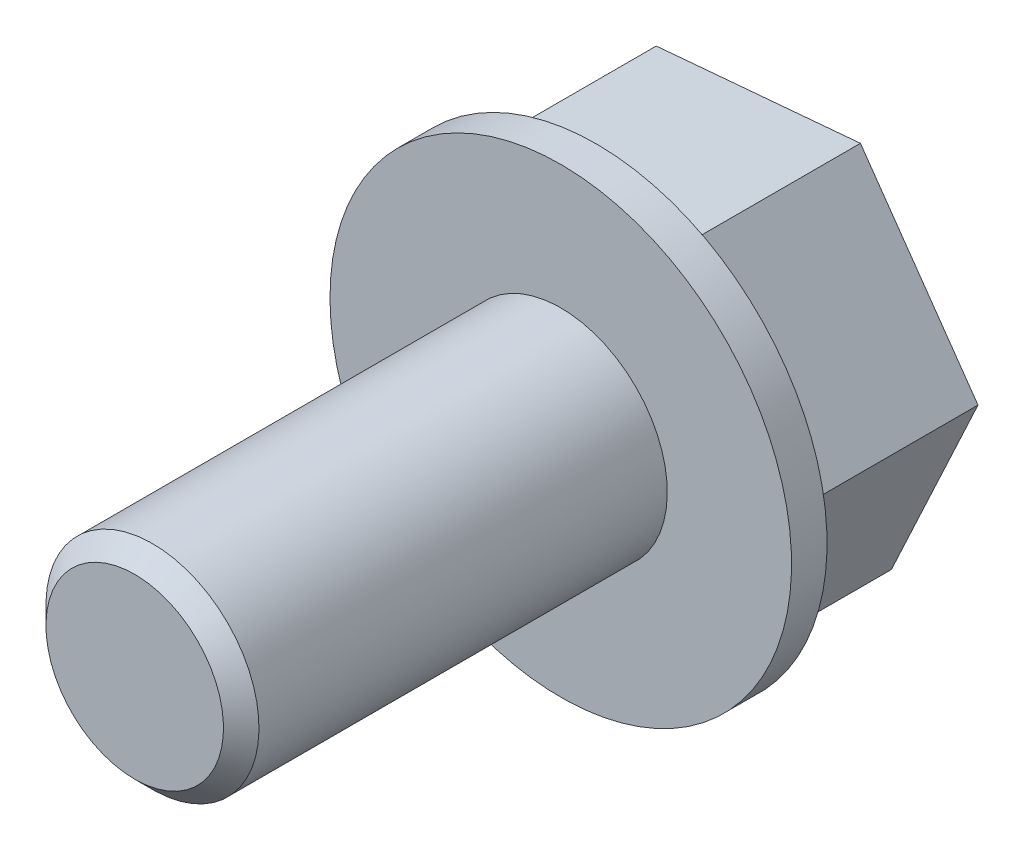
ISO-10303-21;
HEADER;
FILE_DESCRIPTION(('STEP AP214'),'2;1');
FILE_NAME('part.step','',(''),(''),'','','');
FILE_SCHEMA(('AUTOMOTIVE_DESIGN { 1 0 10303 214 1 1 1 1 }'));
ENDSEC;
DATA;
#1=APPLICATION_CONTEXT('core data for automotive mechanical design processes');
#2=APPLICATION_PROTOCOL_DEFINITION('international standard','automotive_design',2000,#1);
#3=PRODUCT_CONTEXT('',#1,'mechanical');
#4=PRODUCT('Part','Part','',(#3));
#5=PRODUCT_RELATED_PRODUCT_CATEGORY('part','',(#4));
#6=PRODUCT_DEFINITION_FORMATION('','',#4);
#7=PRODUCT_DEFINITION_CONTEXT('part definition',#1,'design');
#8=PRODUCT_DEFINITION('design','',#6,#7);
#9=PRODUCT_DEFINITION_SHAPE('','',#8);
#10=(LENGTH_UNIT() NAMED_UNIT(*) SI_UNIT(.MILLI.,.METRE.));
#11=(NAMED_UNIT(*) PLANE_ANGLE_UNIT() SI_UNIT($,.RADIAN.));
#12=(NAMED_UNIT(*) SI_UNIT($,.STERADIAN.) SOLID_ANGLE_UNIT());
#13=UNCERTAINTY_MEASURE_WITH_UNIT(LENGTH_MEASURE(1.E-05),#10,'distance_accuracy_value','');
#14=(GEOMETRIC_REPRESENTATION_CONTEXT(3) GLOBAL_UNCERTAINTY_ASSIGNED_CONTEXT((#13)) GLOBAL_UNIT_ASSIGNED_CONTEXT((#10,
#11,#12)) REPRESENTATION_CONTEXT('',''));
#15=CARTESIAN_POINT('',(0.,0.,0.));
#16=DIRECTION('',(0.,0.,1.));
#17=DIRECTION('',(1.,0.,0.));
#18=AXIS2_PLACEMENT_3D('',#15,#16,#17);
#19=CARTESIAN_POINT('',(-190.549789882902,-68.5538297659745,142.500001559556));
#20=DIRECTION('',(0.,0.,1.));
#21=DIRECTION('',(-0.996194698091746,-0.0871557427476581,0.));
#22=AXIS2_PLACEMENT_3D('',#19,#20,#21);
#23=PLANE('',#22);
#24=CARTESIAN_POINT('',(-190.549789882902,-68.5538297659745,142.500001559556));
#25=DIRECTION('',(0.,0.,1.));
#26=DIRECTION('',(-0.0871557427476581,0.996194698091746,0.));
#27=AXIS2_PLACEMENT_3D('',#24,#25,#26);
#28=CIRCLE('',#27,2.5);
#29=CARTESIAN_POINT('',(-190.767679239771,-66.0633430207451,142.500001559556));
#30=VERTEX_POINT('',#29);
#31=EDGE_CURVE('E25',#30,#30,#28,.T.);
#32=ORIENTED_EDGE('',*,*,#31,.T.);
#33=EDGE_LOOP('',(#32));
#34=FACE_BOUND('',#33,.T.);
#35=ADVANCED_FACE('F17',(#34),#23,.T.);
#36=CARTESIAN_POINT('',(-190.549789882902,-68.5538297659745,130.500001559556));
#37=DIRECTION('',(0.,0.,1.));
#38=DIRECTION('',(-0.996194698091746,-0.0871557427476581,0.));
#39=AXIS2_PLACEMENT_3D('',#36,#37,#38);
#40=CYLINDRICAL_SURFACE('',#39,3.);
#41=CARTESIAN_POINT('',(-190.549789882902,-68.5538297659745,142.000001559556));
#42=DIRECTION('',(0.,0.,1.));
#43=DIRECTION('',(0.996194698091746,0.0871557427476581,0.));
#44=AXIS2_PLACEMENT_3D('',#41,#42,#43);
#45=CIRCLE('',#44,3.);
#46=CARTESIAN_POINT('',(-187.561205788626,-68.2923625377315,142.000001559556));
#47=VERTEX_POINT('',#46);
#48=EDGE_CURVE('E11',#47,#47,#45,.F.);
#49=ORIENTED_EDGE('',*,*,#48,.T.);
#50=EDGE_LOOP('',(#49));
#51=FACE_BOUND('',#50,.T.);
#52=CARTESIAN_POINT('',(-190.549789882902,-68.5538297659745,130.500001559556));
#53=DIRECTION('',(0.,0.,-1.));
#54=DIRECTION('',(-0.996194698091746,-0.0871557427476581,0.));
#55=AXIS2_PLACEMENT_3D('',#52,#53,#54);
#56=CIRCLE('',#55,3.);
#57=CARTESIAN_POINT('',(-193.538373977177,-68.8152969942175,130.500001559556));
#58=VERTEX_POINT('',#57);
#59=EDGE_CURVE('E95',#58,#58,#56,.T.);
#60=ORIENTED_EDGE('',*,*,#59,.F.);
#61=EDGE_LOOP('',(#60));
#62=FACE_BOUND('',#61,.T.);
#63=ADVANCED_FACE('F152',(#51,#62),#40,.T.);
#64=CARTESIAN_POINT('',(-187.238244783621,-73.2832062987488,130.500001559556));
#65=DIRECTION('',(0.,0.,1.));
#66=DIRECTION('',(-0.996194698091746,-0.0871557427476581,0.));
#67=AXIS2_PLACEMENT_3D('',#64,#65,#66);
#68=PLANE('',#67);
#69=ORIENTED_EDGE('',*,*,#59,.T.);
#70=EDGE_LOOP('',(#69));
#71=FACE_BOUND('',#70,.T.);
#72=CARTESIAN_POINT('',(-190.549789882902,-68.553829765974,130.500001559556));
#73=DIRECTION('',(0.,0.,1.));
#74=DIRECTION('',(-0.996194698091746,-0.087155742747658,0.));
#75=AXIS2_PLACEMENT_3D('',#72,#73,#74);
#76=CIRCLE('',#75,6.5);
#77=CARTESIAN_POINT('',(-197.025055420498,-69.1203420938338,130.500001559556));
#78=VERTEX_POINT('',#77);
#79=EDGE_CURVE('E131',#78,#78,#76,.T.);
#80=ORIENTED_EDGE('',*,*,#79,.T.);
#81=EDGE_LOOP('',(#80));
#82=FACE_BOUND('',#81,.T.);
#83=ADVANCED_FACE('F149',(#71,#82),#68,.T.);
#84=CARTESIAN_POINT('',(-190.549789882902,-68.553829765974,129.500001559556));
#85=DIRECTION('',(0.,0.,1.));
#86=DIRECTION('',(-0.996194698091746,-0.0871557427476581,0.));
#87=AXIS2_PLACEMENT_3D('',#84,#85,#86);
#88=CYLINDRICAL_SURFACE('',#87,6.5);
#89=CARTESIAN_POINT('',(-190.549789882902,-68.553829765974,129.500001559556));
#90=DIRECTION('',(0.,0.,1.));
#91=DIRECTION('',(-0.996194698091746,-0.087155742747658,0.));
#92=AXIS2_PLACEMENT_3D('',#89,#90,#91);
#93=CIRCLE('',#92,6.5);
#94=CARTESIAN_POINT('',(-197.025055420498,-69.1203420938338,129.500001559556));
#95=VERTEX_POINT('',#94);
#96=EDGE_CURVE('E130',#95,#95,#93,.T.);
#97=ORIENTED_EDGE('',*,*,#96,.T.);
#98=EDGE_LOOP('',(#97));
#99=FACE_BOUND('',#98,.T.);
#100=ORIENTED_EDGE('',*,*,#79,.F.);
#101=EDGE_LOOP('',(#100));
#102=FACE_BOUND('',#101,.T.);
#103=ADVANCED_FACE('F137',(#99,#102),#88,.T.);
#104=CARTESIAN_POINT('',(-190.549789882902,-68.553829765974,129.500001559556));
#105=DIRECTION('',(0.,0.,-1.));
#106=DIRECTION('',(0.996194698091746,0.0871557427476581,0.));
#107=AXIS2_PLACEMENT_3D('',#104,#105,#106);
#108=PLANE('',#107);
#109=DIRECTION('',(0.573576436351046,-0.819152044288991,0.));
#110=VECTOR('',#109,1.);
#111=CARTESIAN_POINT('',(-188.109802211097,-63.3212593178313,129.500001559556));
#112=LINE('',#111,#110);
#113=CARTESIAN_POINT('',(-188.109802211097,-63.3212593178313,129.500001559556));
#114=VERTEX_POINT('',#113);
#115=CARTESIAN_POINT('',(-184.798257111816,-68.0506358506062,129.500001559556));
#116=VERTEX_POINT('',#115);
#117=EDGE_CURVE('E89',#114,#116,#112,.T.);
#118=ORIENTED_EDGE('',*,*,#117,.F.);
#119=DIRECTION('',(0.996194698091746,0.0871557427476581,0.));
#120=VECTOR('',#119,1.);
#121=CARTESIAN_POINT('',(-193.861334982183,-63.8244532331992,129.500001559556));
#122=LINE('',#121,#120);
#123=CARTESIAN_POINT('',(-193.861334982183,-63.8244532331992,129.500001559556));
#124=VERTEX_POINT('',#123);
#125=EDGE_CURVE('E128',#124,#114,#122,.T.);
#126=ORIENTED_EDGE('',*,*,#125,.F.);
#127=DIRECTION('',(0.422618261740699,0.90630778703665,0.));
#128=VECTOR('',#127,1.);
#129=CARTESIAN_POINT('',(-196.301322653987,-69.0570236813418,129.500001559556));
#130=LINE('',#129,#128);
#131=CARTESIAN_POINT('',(-196.301322653987,-69.0570236813418,129.500001559556));
#132=VERTEX_POINT('',#131);
#133=EDGE_CURVE('E125',#132,#124,#130,.T.);
#134=ORIENTED_EDGE('',*,*,#133,.F.);
#135=DIRECTION('',(-0.573576436351046,0.81915204428899,0.));
#136=VECTOR('',#135,1.);
#137=CARTESIAN_POINT('',(-192.989777554706,-73.7864002141166,129.500001559556));
#138=LINE('',#137,#136);
#139=CARTESIAN_POINT('',(-192.989777554706,-73.7864002141166,129.500001559556));
#140=VERTEX_POINT('',#139);
#141=EDGE_CURVE('E123',#140,#132,#138,.T.);
#142=ORIENTED_EDGE('',*,*,#141,.F.);
#143=DIRECTION('',(-0.996194698091746,-0.0871557427476581,0.));
#144=VECTOR('',#143,1.);
#145=CARTESIAN_POINT('',(-187.238244783621,-73.2832062987488,129.500001559556));
#146=LINE('',#145,#144);
#147=CARTESIAN_POINT('',(-187.238244783621,-73.2832062987488,129.500001559556));
#148=VERTEX_POINT('',#147);
#149=EDGE_CURVE('E91',#148,#140,#146,.T.);
#150=ORIENTED_EDGE('',*,*,#149,.F.);
#151=DIRECTION('',(-0.422618261740699,-0.906307787036651,0.));
#152=VECTOR('',#151,1.);
#153=CARTESIAN_POINT('',(-184.798257111816,-68.0506358506062,129.500001559556));
#154=LINE('',#153,#152);
#155=EDGE_CURVE('E73',#116,#148,#154,.T.);
#156=ORIENTED_EDGE('',*,*,#155,.F.);
#157=EDGE_LOOP('',(#118,#126,#134,#142,#150,#156));
#158=FACE_BOUND('',#157,.T.);
#159=ORIENTED_EDGE('',*,*,#96,.F.);
#160=EDGE_LOOP('',(#159));
#161=FACE_BOUND('',#160,.T.);
#162=ADVANCED_FACE('F86',(#158,#161),#108,.T.);
#163=CARTESIAN_POINT('',(-187.238244783621,-73.2832062987488,124.500001559556));
#164=DIRECTION('',(0.,0.,1.));
#165=DIRECTION('',(-0.996194698091746,-0.0871557427476581,0.));
#166=AXIS2_PLACEMENT_3D('',#163,#164,#165);
#167=PLANE('',#166);
#168=DIRECTION('',(-0.422618261740699,-0.906307787036651,0.));
#169=VECTOR('',#168,1.);
#170=CARTESIAN_POINT('',(-184.798257111816,-68.0506358506062,124.500001559556));
#171=LINE('',#170,#169);
#172=CARTESIAN_POINT('',(-184.798257111816,-68.0506358506062,124.500001559556));
#173=VERTEX_POINT('',#172);
#174=CARTESIAN_POINT('',(-187.238244783621,-73.2832062987488,124.500001559556));
#175=VERTEX_POINT('',#174);
#176=EDGE_CURVE('E76',#173,#175,#171,.T.);
#177=ORIENTED_EDGE('',*,*,#176,.T.);
#178=DIRECTION('',(-0.996194698091746,-0.0871557427476581,0.));
#179=VECTOR('',#178,1.);
#180=CARTESIAN_POINT('',(-187.238244783621,-73.2832062987488,124.500001559556));
#181=LINE('',#180,#179);
#182=CARTESIAN_POINT('',(-192.989777554706,-73.7864002141166,124.500001559556));
#183=VERTEX_POINT('',#182);
#184=EDGE_CURVE('E118',#175,#183,#181,.T.);
#185=ORIENTED_EDGE('',*,*,#184,.T.);
#186=DIRECTION('',(-0.573576436351046,0.81915204428899,0.));
#187=VECTOR('',#186,1.);
#188=CARTESIAN_POINT('',(-192.989777554706,-73.7864002141166,124.500001559556));
#189=LINE('',#188,#187);
#190=CARTESIAN_POINT('',(-196.301322653987,-69.0570236813418,124.500001559556));
#191=VERTEX_POINT('',#190);
#192=EDGE_CURVE('E115',#183,#191,#189,.T.);
#193=ORIENTED_EDGE('',*,*,#192,.T.);
#194=DIRECTION('',(0.422618261740699,0.90630778703665,0.));
#195=VECTOR('',#194,1.);
#196=CARTESIAN_POINT('',(-196.301322653987,-69.0570236813418,124.500001559556));
#197=LINE('',#196,#195);
#198=CARTESIAN_POINT('',(-193.861334982183,-63.8244532331992,124.500001559556));
#199=VERTEX_POINT('',#198);
#200=EDGE_CURVE('E112',#191,#199,#197,.T.);
#201=ORIENTED_EDGE('',*,*,#200,.T.);
#202=DIRECTION('',(0.996194698091746,0.0871557427476581,0.));
#203=VECTOR('',#202,1.);
#204=CARTESIAN_POINT('',(-193.861334982183,-63.8244532331992,124.500001559556));
#205=LINE('',#204,#203);
#206=CARTESIAN_POINT('',(-188.109802211097,-63.3212593178313,124.500001559556));
#207=VERTEX_POINT('',#206);
#208=EDGE_CURVE('E109',#199,#207,#205,.T.);
#209=ORIENTED_EDGE('',*,*,#208,.T.);
#210=DIRECTION('',(0.573576436351046,-0.819152044288991,0.));
#211=VECTOR('',#210,1.);
#212=CARTESIAN_POINT('',(-188.109802211097,-63.3212593178313,124.500001559556));
#213=LINE('',#212,#211);
#214=EDGE_CURVE('E82',#207,#173,#213,.T.);
#215=ORIENTED_EDGE('',*,*,#214,.T.);
#216=EDGE_LOOP('',(#177,#185,#193,#201,#209,#215));
#217=FACE_BOUND('',#216,.T.);
#218=ADVANCED_FACE('F140',(#217),#167,.F.);
#219=CARTESIAN_POINT('',(-188.109802211097,-63.3212593178313,124.500001559556));
#220=DIRECTION('',(0.819152044288991,0.573576436351046,0.));
#221=DIRECTION('',(0.573576436351046,-0.819152044288991,0.));
#222=AXIS2_PLACEMENT_3D('',#219,#220,#221);
#223=PLANE('',#222);
#224=ORIENTED_EDGE('',*,*,#117,.T.);
#225=DIRECTION('',(0.,0.,1.));
#226=VECTOR('',#225,1.);
#227=CARTESIAN_POINT('',(-184.798257111816,-68.0506358506062,124.500001559556));
#228=LINE('',#227,#226);
#229=EDGE_CURVE('E70',#173,#116,#228,.T.);
#230=ORIENTED_EDGE('',*,*,#229,.F.);
#231=ORIENTED_EDGE('',*,*,#214,.F.);
#232=DIRECTION('',(0.,0.,1.));
#233=VECTOR('',#232,1.);
#234=CARTESIAN_POINT('',(-188.109802211097,-63.3212593178313,124.500001559556));
#235=LINE('',#234,#233);
#236=EDGE_CURVE('E81',#207,#114,#235,.T.);
#237=ORIENTED_EDGE('',*,*,#236,.T.);
#238=EDGE_LOOP('',(#224,#230,#231,#237));
#239=FACE_BOUND('',#238,.T.);
#240=ADVANCED_FACE('F93',(#239),#223,.T.);
#241=CARTESIAN_POINT('',(-193.861334982183,-63.8244532331992,124.500001559556));
#242=DIRECTION('',(-0.0871557427476581,0.996194698091746,0.));
#243=DIRECTION('',(0.996194698091746,0.0871557427476581,0.));
#244=AXIS2_PLACEMENT_3D('',#241,#242,#243);
#245=PLANE('',#244);
#246=ORIENTED_EDGE('',*,*,#125,.T.);
#247=ORIENTED_EDGE('',*,*,#236,.F.);
#248=ORIENTED_EDGE('',*,*,#208,.F.);
#249=DIRECTION('',(0.,0.,1.));
#250=VECTOR('',#249,1.);
#251=CARTESIAN_POINT('',(-193.861334982183,-63.8244532331992,124.500001559556));
#252=LINE('',#251,#250);
#253=EDGE_CURVE('E105',#199,#124,#252,.T.);
#254=ORIENTED_EDGE('',*,*,#253,.T.);
#255=EDGE_LOOP('',(#246,#247,#248,#254));
#256=FACE_BOUND('',#255,.T.);
#257=ADVANCED_FACE('F171',(#256),#245,.T.);
#258=CARTESIAN_POINT('',(-196.301322653987,-69.0570236813418,124.500001559556));
#259=DIRECTION('',(-0.90630778703665,0.422618261740699,0.));
#260=DIRECTION('',(0.422618261740699,0.90630778703665,0.));
#261=AXIS2_PLACEMENT_3D('',#258,#259,#260);
#262=PLANE('',#261);
#263=ORIENTED_EDGE('',*,*,#133,.T.);
#264=ORIENTED_EDGE('',*,*,#253,.F.);
#265=ORIENTED_EDGE('',*,*,#200,.F.);
#266=DIRECTION('',(0.,0.,1.));
#267=VECTOR('',#266,1.);
#268=CARTESIAN_POINT('',(-196.301322653987,-69.0570236813418,124.500001559556));
#269=LINE('',#268,#267);
#270=EDGE_CURVE('E103',#191,#132,#269,.T.);
#271=ORIENTED_EDGE('',*,*,#270,.T.);
#272=EDGE_LOOP('',(#263,#264,#265,#271));
#273=FACE_BOUND('',#272,.T.);
#274=ADVANCED_FACE('F168',(#273),#262,.T.);
#275=CARTESIAN_POINT('',(-192.989777554706,-73.7864002141166,124.500001559556));
#276=DIRECTION('',(-0.81915204428899,-0.573576436351046,0.));
#277=DIRECTION('',(-0.573576436351046,0.81915204428899,0.));
#278=AXIS2_PLACEMENT_3D('',#275,#276,#277);
#279=PLANE('',#278);
#280=ORIENTED_EDGE('',*,*,#141,.T.);
#281=ORIENTED_EDGE('',*,*,#270,.F.);
#282=ORIENTED_EDGE('',*,*,#192,.F.);
#283=DIRECTION('',(0.,0.,1.));
#284=VECTOR('',#283,1.);
#285=CARTESIAN_POINT('',(-192.989777554706,-73.7864002141166,124.500001559556));
#286=LINE('',#285,#284);
#287=EDGE_CURVE('E40',#183,#140,#286,.T.);
#288=ORIENTED_EDGE('',*,*,#287,.T.);
#289=EDGE_LOOP('',(#280,#281,#282,#288));
#290=FACE_BOUND('',#289,.T.);
#291=ADVANCED_FACE('F165',(#290),#279,.T.);
#292=CARTESIAN_POINT('',(-187.238244783621,-73.2832062987488,124.500001559556));
#293=DIRECTION('',(0.0871557427476581,-0.996194698091746,0.));
#294=DIRECTION('',(-0.996194698091746,-0.0871557427476581,0.));
#295=AXIS2_PLACEMENT_3D('',#292,#293,#294);
#296=PLANE('',#295);
#297=ORIENTED_EDGE('',*,*,#149,.T.);
#298=ORIENTED_EDGE('',*,*,#287,.F.);
#299=ORIENTED_EDGE('',*,*,#184,.F.);
#300=DIRECTION('',(0.,0.,1.));
#301=VECTOR('',#300,1.);
#302=CARTESIAN_POINT('',(-187.238244783621,-73.2832062987488,124.500001559556));
#303=LINE('',#302,#301);
#304=EDGE_CURVE('E32',#175,#148,#303,.T.);
#305=ORIENTED_EDGE('',*,*,#304,.T.);
#306=EDGE_LOOP('',(#297,#298,#299,#305));
#307=FACE_BOUND('',#306,.T.);
#308=ADVANCED_FACE('F162',(#307),#296,.T.);
#309=CARTESIAN_POINT('',(-184.798257111816,-68.0506358506062,124.500001559556));
#310=DIRECTION('',(0.906307787036651,-0.422618261740699,0.));
#311=DIRECTION('',(-0.422618261740699,-0.906307787036651,0.));
#312=AXIS2_PLACEMENT_3D('',#309,#310,#311);
#313=PLANE('',#312);
#314=ORIENTED_EDGE('',*,*,#155,.T.);
#315=ORIENTED_EDGE('',*,*,#304,.F.);
#316=ORIENTED_EDGE('',*,*,#176,.F.);
#317=ORIENTED_EDGE('',*,*,#229,.T.);
#318=EDGE_LOOP('',(#314,#315,#316,#317));
#319=FACE_BOUND('',#318,.T.);
#320=ADVANCED_FACE('F72',(#319),#313,.T.);
#321=CARTESIAN_POINT('',(-190.549789882902,-68.5538297659745,142.500001559556));
#322=DIRECTION('',(0.,0.,-1.));
#323=DIRECTION('',(-0.996194698091746,-0.0871557427476581,0.));
#324=AXIS2_PLACEMENT_3D('',#321,#322,#323);
#325=CONICAL_SURFACE('',#324,2.5,0.785398163397448);
#326=ORIENTED_EDGE('',*,*,#48,.F.);
#327=EDGE_LOOP('',(#326));
#328=FACE_BOUND('',#327,.T.);
#329=ORIENTED_EDGE('',*,*,#31,.F.);
#330=EDGE_LOOP('',(#329));
#331=FACE_BOUND('',#330,.T.);
#332=ADVANCED_FACE('F19',(#328,#331),#325,.T.);
#333=CLOSED_SHELL('',(#35,#63,#83,#103,#162,#218,#240,#257,#274,#291,#308,#320,#332));
#334=MANIFOLD_SOLID_BREP('B1',#333);
#335=ADVANCED_BREP_SHAPE_REPRESENTATION('',(#18,#334),#14);
#336=SHAPE_DEFINITION_REPRESENTATION(#9,#335);
ENDSEC;
END-ISO-10303-21;
